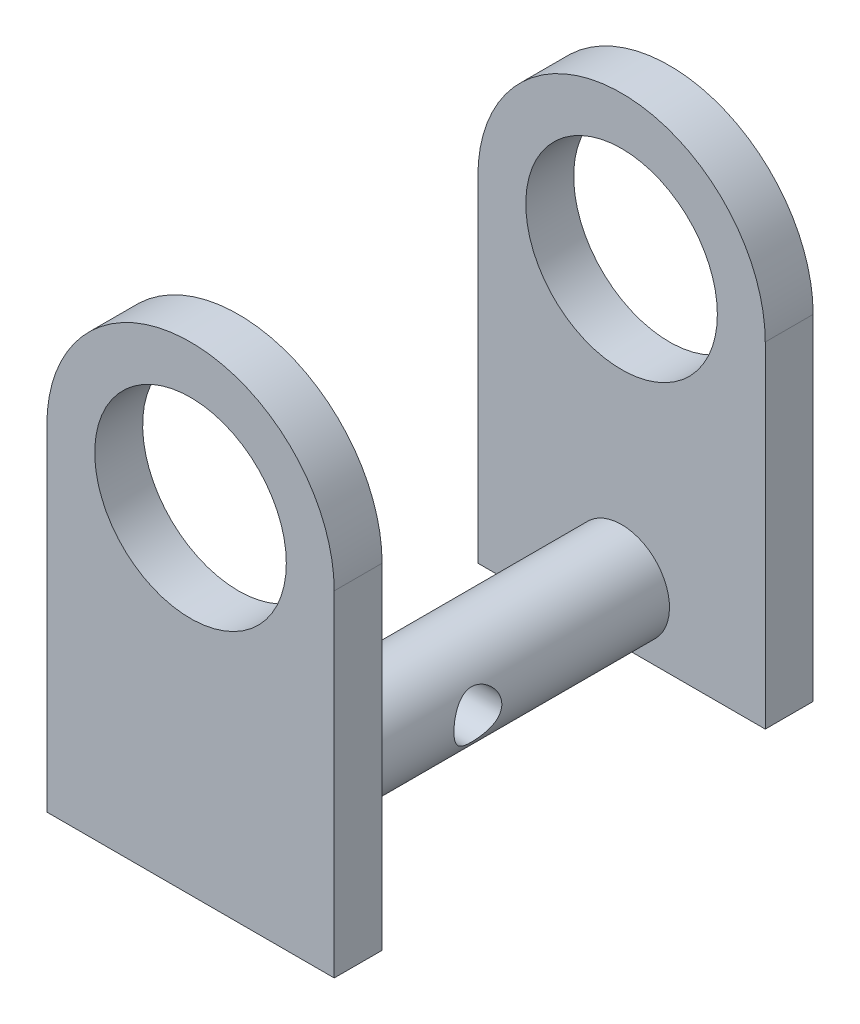
ISO-10303-21;
HEADER;
FILE_DESCRIPTION(('STEP AP214'),'2;1');
FILE_NAME('part.step','',(''),(''),'','','');
FILE_SCHEMA(('AUTOMOTIVE_DESIGN { 1 0 10303 214 1 1 1 1 }'));
ENDSEC;
DATA;
#1=APPLICATION_CONTEXT('core data for automotive mechanical design processes');
#2=APPLICATION_PROTOCOL_DEFINITION('international standard','automotive_design',2000,#1);
#3=PRODUCT_CONTEXT('',#1,'mechanical');
#4=PRODUCT('Part','Part','',(#3));
#5=PRODUCT_RELATED_PRODUCT_CATEGORY('part','',(#4));
#6=PRODUCT_DEFINITION_FORMATION('','',#4);
#7=PRODUCT_DEFINITION_CONTEXT('part definition',#1,'design');
#8=PRODUCT_DEFINITION('design','',#6,#7);
#9=PRODUCT_DEFINITION_SHAPE('','',#8);
#10=(LENGTH_UNIT() NAMED_UNIT(*) SI_UNIT(.MILLI.,.METRE.));
#11=(NAMED_UNIT(*) PLANE_ANGLE_UNIT() SI_UNIT($,.RADIAN.));
#12=(NAMED_UNIT(*) SI_UNIT($,.STERADIAN.) SOLID_ANGLE_UNIT());
#13=UNCERTAINTY_MEASURE_WITH_UNIT(LENGTH_MEASURE(1.E-05),#10,'distance_accuracy_value','');
#14=(GEOMETRIC_REPRESENTATION_CONTEXT(3) GLOBAL_UNCERTAINTY_ASSIGNED_CONTEXT((#13)) GLOBAL_UNIT_ASSIGNED_CONTEXT((#10,
#11,#12)) REPRESENTATION_CONTEXT('',''));
#15=CARTESIAN_POINT('',(0.,0.,0.));
#16=DIRECTION('',(0.,0.,1.));
#17=DIRECTION('',(1.,0.,0.));
#18=AXIS2_PLACEMENT_3D('',#15,#16,#17);
#19=CARTESIAN_POINT('',(0.,-29.,-1.99999999999995));
#20=DIRECTION('',(0.,0.,-1.));
#21=DIRECTION('',(-1.,0.,0.));
#22=AXIS2_PLACEMENT_3D('',#19,#20,#21);
#23=CYLINDRICAL_SURFACE('',#22,5.);
#24=CARTESIAN_POINT('',(-5.,-29.,-22.5));
#25=CARTESIAN_POINT('',(-4.99999177550472,-28.8685733176657,-22.500009669056));
#26=CARTESIAN_POINT('',(-4.99476199135278,-28.7369843655628,-22.510425561774));
#27=CARTESIAN_POINT('',(-4.9743541856102,-28.4776985453771,-22.551631821162));
#28=CARTESIAN_POINT('',(-4.95915727187671,-28.3500095514359,-22.582460880925));
#29=CARTESIAN_POINT('',(-4.92040690922477,-28.1026663686838,-22.6629846227188));
#30=CARTESIAN_POINT('',(-4.8968859590726,-27.9829830546372,-22.7126059877827));
#31=CARTESIAN_POINT('',(-4.84364443325828,-27.7538183960033,-22.8289265262518));
#32=CARTESIAN_POINT('',(-4.81392434644421,-27.6443362479623,-22.8956243531451));
#33=CARTESIAN_POINT('',(-4.74890645050632,-27.43123047369,-23.0487931316426));
#34=CARTESIAN_POINT('',(-4.71337997659091,-27.3283619770569,-23.1362162002298));
#35=CARTESIAN_POINT('',(-4.64149925776731,-27.1380513829667,-23.3263036959853));
#36=CARTESIAN_POINT('',(-4.60514440566898,-27.0506210408845,-23.4289796288401));
#37=CARTESIAN_POINT('',(-4.53247377945622,-26.8868700003275,-23.6562083744453));
#38=CARTESIAN_POINT('',(-4.49637967412567,-26.8119366615094,-23.781840246035));
#39=CARTESIAN_POINT('',(-4.43214946943555,-26.6845794323851,-24.0459183397954));
#40=CARTESIAN_POINT('',(-4.40400769020792,-26.6321394624832,-24.1843553217626));
#41=CARTESIAN_POINT('',(-4.36144667591402,-26.5546688946235,-24.4616627635964));
#42=CARTESIAN_POINT('',(-4.34630678958452,-26.5281853573242,-24.6000111301796));
#43=CARTESIAN_POINT('',(-4.32954724872151,-26.4989325167026,-24.8799470944376));
#44=CARTESIAN_POINT('',(-4.3279142335843,-26.4961397790609,-25.0215313521751));
#45=CARTESIAN_POINT('',(-4.33777325642937,-26.5132817820749,-25.2857150607909));
#46=CARTESIAN_POINT('',(-4.34771909154985,-26.5305386011595,-25.4085600780583));
#47=CARTESIAN_POINT('',(-4.37690571834676,-26.5826503773562,-25.6493047734319));
#48=CARTESIAN_POINT('',(-4.39614947079454,-26.6175109402555,-25.7672028632631));
#49=CARTESIAN_POINT('',(-4.44218691031839,-26.7044755490354,-25.9980728314143));
#50=CARTESIAN_POINT('',(-4.46914601659993,-26.7569623322101,-26.1108659969645));
#51=CARTESIAN_POINT('',(-4.52758510703513,-26.8773957808299,-26.326585731475));
#52=CARTESIAN_POINT('',(-4.55906711950478,-26.9453493904688,-26.4295078390002));
#53=CARTESIAN_POINT('',(-4.62782894758213,-27.1048348627181,-26.6363031318581));
#54=CARTESIAN_POINT('',(-4.66533775591865,-27.1982638540768,-26.7386421839404));
#55=CARTESIAN_POINT('',(-4.73869058251019,-27.4011110531466,-26.9268385464772));
#56=CARTESIAN_POINT('',(-4.77453379897003,-27.5105368585643,-27.0126879800847));
#57=CARTESIAN_POINT('',(-4.84254968207409,-27.7487087354204,-27.1692141525743));
#58=CARTESIAN_POINT('',(-4.87447460405015,-27.8781160210015,-27.2390011811143));
#59=CARTESIAN_POINT('',(-4.92894702803109,-28.148834461278,-27.3552425726075));
#60=CARTESIAN_POINT('',(-4.95150197358894,-28.2901360593368,-27.4017154625379));
#61=CARTESIAN_POINT('',(-4.98310834353579,-28.5680837708482,-27.4661885092917));
#62=CARTESIAN_POINT('',(-4.9931234575324,-28.7041461736291,-27.486228089367));
#63=CARTESIAN_POINT('',(-5.00182533647794,-28.9780510001267,-27.5036618278362));
#64=CARTESIAN_POINT('',(-5.00051746803426,-29.1158925496751,-27.5010667140985));
#65=CARTESIAN_POINT('',(-4.98727980633469,-29.3780824299647,-27.4744832789533));
#66=CARTESIAN_POINT('',(-4.97618114219993,-29.5026485201237,-27.4521686681756));
#67=CARTESIAN_POINT('',(-4.9455542828753,-29.746017230756,-27.3894048202616));
#68=CARTESIAN_POINT('',(-4.92602515837625,-29.8648192142319,-27.3489535838641));
#69=CARTESIAN_POINT('',(-4.87960628532329,-30.0972215211196,-27.2500038339196));
#70=CARTESIAN_POINT('',(-4.85252204417874,-30.2105759924983,-27.1910223747177));
#71=CARTESIAN_POINT('',(-4.79359935799751,-30.4261534042644,-27.0572311608752));
#72=CARTESIAN_POINT('',(-4.76175888940535,-30.528371574502,-26.9824146634801));
#73=CARTESIAN_POINT('',(-4.69270553315087,-30.7294192231549,-26.8105989367091));
#74=CARTESIAN_POINT('',(-4.65527212009489,-30.826930194285,-26.7121428290248));
#75=CARTESIAN_POINT('',(-4.58155978921588,-31.0046408025722,-26.5001871219506));
#76=CARTESIAN_POINT('',(-4.54528168472408,-31.0848284642868,-26.3866772029301));
#77=CARTESIAN_POINT('',(-4.4762798054528,-31.2292697861899,-26.1408908645153));
#78=CARTESIAN_POINT('',(-4.44381323981255,-31.2925637392224,-26.0079718347089));
#79=CARTESIAN_POINT('',(-4.38935180726746,-31.3952070651146,-25.7312248311174));
#80=CARTESIAN_POINT('',(-4.36734345549015,-31.4345872907706,-25.587411184));
#81=CARTESIAN_POINT('',(-4.33903752569352,-31.48465421767,-25.3077244426371));
#82=CARTESIAN_POINT('',(-4.33143458674097,-31.4977324874436,-25.172414365881));
#83=CARTESIAN_POINT('',(-4.3291338659258,-31.501722889509,-24.9013823326193));
#84=CARTESIAN_POINT('',(-4.33443049025111,-31.4926446298327,-24.7656605801264));
#85=CARTESIAN_POINT('',(-4.35594655164664,-31.4548153019733,-24.5112912443832));
#86=CARTESIAN_POINT('',(-4.37107736338133,-31.428020743027,-24.3922488182792));
#87=CARTESIAN_POINT('',(-4.40927540337603,-31.3579384384054,-24.1604797078));
#88=CARTESIAN_POINT('',(-4.43234518434966,-31.3146453872873,-24.0477550684335));
#89=CARTESIAN_POINT('',(-4.48571326433413,-31.2095391931554,-23.8234378472803));
#90=CARTESIAN_POINT('',(-4.5163930799845,-31.146677190094,-23.712430148265));
#91=CARTESIAN_POINT('',(-4.58088327077456,-31.0053780838799,-23.50181375676));
#92=CARTESIAN_POINT('',(-4.61469526970767,-30.9269328776589,-23.4022110373713));
#93=CARTESIAN_POINT('',(-4.68655816327011,-30.7455055694607,-23.2046446362504));
#94=CARTESIAN_POINT('',(-4.72462491514981,-30.6407002246921,-23.1083506358286));
#95=CARTESIAN_POINT('',(-4.79694347383546,-30.4153978542068,-22.9343441505719));
#96=CARTESIAN_POINT('',(-4.83119321905447,-30.2948924242633,-22.8566416813941));
#97=CARTESIAN_POINT('',(-4.89245149457782,-30.0397880887854,-22.7219030205159));
#98=CARTESIAN_POINT('',(-4.91940711437489,-29.9050955607823,-22.6650168322155));
#99=CARTESIAN_POINT('',(-4.95177960923351,-29.6963287092574,-22.5978161412076));
#100=CARTESIAN_POINT('',(-4.96122314081874,-29.6256704134941,-22.5784446019982));
#101=CARTESIAN_POINT('',(-4.97717127275101,-29.4826239978393,-22.5459340516294));
#102=CARTESIAN_POINT('',(-4.98367766823159,-29.4102369630924,-22.5327912333236));
#103=CARTESIAN_POINT('',(-4.9923820076613,-29.2815186846217,-22.5152625277154));
#104=CARTESIAN_POINT('',(-4.99523288466454,-29.2254084995554,-22.5095450634687));
#105=CARTESIAN_POINT('',(-4.99904367329659,-29.1128755284563,-22.5019116705343));
#106=CARTESIAN_POINT('',(-5.00000353273198,-29.0564527338382,-22.4999958467745));
#107=CARTESIAN_POINT('',(-5.,-29.,-22.5));
#108=B_SPLINE_CURVE_WITH_KNOTS('',3,(#24,#25,#26,#27,#28,#29,#30,#31,#32,#33,#34,#35,#36,#37,
#38,#39,#40,#41,#42,#43,#44,#45,#46,#47,#48,#49,#50,#51,#52,#53,#54,#55,#56,#57,#58,#59,#60,#61,
#62,#63,#64,#65,#66,#67,#68,#69,#70,#71,#72,#73,#74,#75,#76,#77,#78,#79,#80,#81,#82,#83,#84,#85,
#86,#87,#88,#89,#90,#91,#92,#93,#94,#95,#96,#97,#98,#99,#100,#101,#102,#103,#104,#105,#106,
#107),.UNSPECIFIED.,.T.,.F.,(4,2,2,2,2,2,2,2,2,2,2,2,2,2,2,2,2,2,2,2,2,2,2,2,2,2,2,2,2,2,2,2,2,
2,2,2,2,2,2,2,2,4),(0.,0.39406064355073,0.788870374272992,1.18215538873074,1.57540940145391,
1.99245439679522,2.40981559413508,2.85954316076881,3.30894869745702,3.73145030350574,
4.15353393322551,4.52514281023301,4.89687009814196,5.27725600421218,5.65781303150554,
6.08662353334696,6.51563836496716,6.96457555536101,7.41315542280698,7.82458226178363,
8.2358141127869,8.61517266265304,8.99457304077329,9.38482140069746,9.77523626870848,
10.2039902661037,10.6330397153795,11.0828670540368,11.53211279863,11.9382326875698,
12.3441764966106,12.7114482562151,13.0788382197025,13.4709114195009,13.8631890285845,
14.303131068923,14.7433095845248,15.1866003415818,15.407934939208,15.6291340766843,
15.7983933645035,15.9676573239322),.UNSPECIFIED.);
#109=CARTESIAN_POINT('',(-5.,-29.,-22.5));
#110=VERTEX_POINT('',#109);
#111=EDGE_CURVE('E53',#110,#110,#108,.T.);
#112=ORIENTED_EDGE('',*,*,#111,.F.);
#113=EDGE_LOOP('',(#112));
#114=FACE_BOUND('',#113,.T.);
#115=CARTESIAN_POINT('',(5.00000000000001,-29.,-27.5));
#116=CARTESIAN_POINT('',(4.99999177550472,-28.8685733176657,-27.499990330944));
#117=CARTESIAN_POINT('',(4.99476199135278,-28.7369843655628,-27.489574438226));
#118=CARTESIAN_POINT('',(4.9743541856102,-28.4776985453771,-27.4483681788379));
#119=CARTESIAN_POINT('',(4.95915727187671,-28.3500095514359,-27.417539119075));
#120=CARTESIAN_POINT('',(4.92040690922477,-28.1026663686838,-27.3370153772811));
#121=CARTESIAN_POINT('',(4.89688595907259,-27.9829830546372,-27.2873940122173));
#122=CARTESIAN_POINT('',(4.84364443325827,-27.7538183960033,-27.1710734737482));
#123=CARTESIAN_POINT('',(4.81392434644421,-27.6443362479623,-27.1043756468549));
#124=CARTESIAN_POINT('',(4.74890645050632,-27.43123047369,-26.9512068683574));
#125=CARTESIAN_POINT('',(4.71337997659091,-27.3283619770569,-26.8637837997702));
#126=CARTESIAN_POINT('',(4.64149925776731,-27.1380513829667,-26.6736963040147));
#127=CARTESIAN_POINT('',(4.60514440566897,-27.0506210408844,-26.5710203711599));
#128=CARTESIAN_POINT('',(4.53247377945622,-26.8868700003275,-26.3437916255547));
#129=CARTESIAN_POINT('',(4.49637967412567,-26.8119366615094,-26.218159753965));
#130=CARTESIAN_POINT('',(4.43214946943555,-26.6845794323851,-25.9540816602045));
#131=CARTESIAN_POINT('',(4.40400769020792,-26.6321394624832,-25.8156446782374));
#132=CARTESIAN_POINT('',(4.36144667591402,-26.5546688946235,-25.5383372364036));
#133=CARTESIAN_POINT('',(4.34630678958452,-26.5281853573242,-25.3999888698204));
#134=CARTESIAN_POINT('',(4.32954724872151,-26.4989325167026,-25.1200529055624));
#135=CARTESIAN_POINT('',(4.3279142335843,-26.4961397790609,-24.9784686478249));
#136=CARTESIAN_POINT('',(4.33777325642937,-26.5132817820749,-24.7142849392091));
#137=CARTESIAN_POINT('',(4.34771909154985,-26.5305386011595,-24.5914399219417));
#138=CARTESIAN_POINT('',(4.37690571834676,-26.5826503773562,-24.350695226568));
#139=CARTESIAN_POINT('',(4.39614947079454,-26.6175109402555,-24.2327971367369));
#140=CARTESIAN_POINT('',(4.44218691031839,-26.7044755490354,-24.0019271685857));
#141=CARTESIAN_POINT('',(4.46914601659993,-26.7569623322101,-23.8891340030355));
#142=CARTESIAN_POINT('',(4.52758510703513,-26.8773957808299,-23.673414268525));
#143=CARTESIAN_POINT('',(4.55906711950478,-26.9453493904688,-23.5704921609998));
#144=CARTESIAN_POINT('',(4.62782894758214,-27.1048348627181,-23.3636968681419));
#145=CARTESIAN_POINT('',(4.66533775591865,-27.1982638540768,-23.2613578160596));
#146=CARTESIAN_POINT('',(4.73869058251019,-27.4011110531466,-23.0731614535227));
#147=CARTESIAN_POINT('',(4.77453379897003,-27.5105368585643,-22.9873120199153));
#148=CARTESIAN_POINT('',(4.84254968207409,-27.7487087354204,-22.8307858474257));
#149=CARTESIAN_POINT('',(4.87447460405016,-27.8781160210015,-22.7609988188856));
#150=CARTESIAN_POINT('',(4.92894702803109,-28.148834461278,-22.6447574273925));
#151=CARTESIAN_POINT('',(4.95150197358894,-28.2901360593368,-22.5982845374621));
#152=CARTESIAN_POINT('',(4.9831083435358,-28.5680837708482,-22.5338114907083));
#153=CARTESIAN_POINT('',(4.9931234575324,-28.7041461736291,-22.513771910633));
#154=CARTESIAN_POINT('',(5.00182533647794,-28.9780510001267,-22.4963381721638));
#155=CARTESIAN_POINT('',(5.00051746803426,-29.1158925496751,-22.4989332859015));
#156=CARTESIAN_POINT('',(4.98727980633469,-29.3780824299647,-22.5255167210467));
#157=CARTESIAN_POINT('',(4.97618114219993,-29.5026485201237,-22.5478313318244));
#158=CARTESIAN_POINT('',(4.9455542828753,-29.746017230756,-22.6105951797384));
#159=CARTESIAN_POINT('',(4.92602515837625,-29.8648192142319,-22.6510464161359));
#160=CARTESIAN_POINT('',(4.87960628532329,-30.0972215211196,-22.7499961660804));
#161=CARTESIAN_POINT('',(4.85252204417874,-30.2105759924983,-22.8089776252823));
#162=CARTESIAN_POINT('',(4.79359935799751,-30.4261534042644,-22.9427688391248));
#163=CARTESIAN_POINT('',(4.76175888940535,-30.528371574502,-23.0175853365199));
#164=CARTESIAN_POINT('',(4.69270553315087,-30.7294192231549,-23.1894010632909));
#165=CARTESIAN_POINT('',(4.65527212009488,-30.826930194285,-23.2878571709752));
#166=CARTESIAN_POINT('',(4.58155978921587,-31.0046408025722,-23.4998128780494));
#167=CARTESIAN_POINT('',(4.54528168472408,-31.0848284642869,-23.6133227970699));
#168=CARTESIAN_POINT('',(4.4762798054528,-31.2292697861899,-23.8591091354846));
#169=CARTESIAN_POINT('',(4.44381323981255,-31.2925637392224,-23.9920281652911));
#170=CARTESIAN_POINT('',(4.38935180726746,-31.3952070651146,-24.2687751688825));
#171=CARTESIAN_POINT('',(4.36734345549014,-31.4345872907706,-24.412588816));
#172=CARTESIAN_POINT('',(4.33903752569352,-31.4846542176701,-24.6922755573629));
#173=CARTESIAN_POINT('',(4.33143458674097,-31.4977324874436,-24.827585634119));
#174=CARTESIAN_POINT('',(4.3291338659258,-31.501722889509,-25.0986176673807));
#175=CARTESIAN_POINT('',(4.33443049025111,-31.4926446298327,-25.2343394198736));
#176=CARTESIAN_POINT('',(4.35594655164664,-31.4548153019733,-25.4887087556168));
#177=CARTESIAN_POINT('',(4.37107736338134,-31.428020743027,-25.6077511817208));
#178=CARTESIAN_POINT('',(4.40927540337603,-31.3579384384054,-25.8395202921999));
#179=CARTESIAN_POINT('',(4.43234518434966,-31.3146453872873,-25.9522449315665));
#180=CARTESIAN_POINT('',(4.48571326433413,-31.2095391931554,-26.1765621527197));
#181=CARTESIAN_POINT('',(4.5163930799845,-31.146677190094,-26.287569851735));
#182=CARTESIAN_POINT('',(4.58088327077456,-31.0053780838799,-26.49818624324));
#183=CARTESIAN_POINT('',(4.61469526970767,-30.9269328776589,-26.5977889626287));
#184=CARTESIAN_POINT('',(4.68655816327011,-30.7455055694607,-26.7953553637496));
#185=CARTESIAN_POINT('',(4.72462491514981,-30.6407002246921,-26.8916493641714));
#186=CARTESIAN_POINT('',(4.79694347383546,-30.4153978542068,-27.065655849428));
#187=CARTESIAN_POINT('',(4.83119321905447,-30.2948924242633,-27.1433583186059));
#188=CARTESIAN_POINT('',(4.89245149457782,-30.0397880887854,-27.2780969794841));
#189=CARTESIAN_POINT('',(4.91940711437489,-29.9050955607823,-27.3349831677844));
#190=CARTESIAN_POINT('',(4.95177960923351,-29.6963287092574,-27.4021838587924));
#191=CARTESIAN_POINT('',(4.96122314081874,-29.6256704134941,-27.4215553980018));
#192=CARTESIAN_POINT('',(4.97717127275101,-29.4826239978393,-27.4540659483706));
#193=CARTESIAN_POINT('',(4.98367766823159,-29.4102369630924,-27.4672087666763));
#194=CARTESIAN_POINT('',(4.9923820076613,-29.2815186846217,-27.4847374722846));
#195=CARTESIAN_POINT('',(4.99523288466455,-29.2254084995554,-27.4904549365313));
#196=CARTESIAN_POINT('',(4.99904367329659,-29.1128755284563,-27.4980883294657));
#197=CARTESIAN_POINT('',(5.00000353273198,-29.0564527338382,-27.5000041532255));
#198=CARTESIAN_POINT('',(5.00000000000001,-29.,-27.5));
#199=B_SPLINE_CURVE_WITH_KNOTS('',3,(#115,#116,#117,#118,#119,#120,#121,#122,#123,#124,#125,
#126,#127,#128,#129,#130,#131,#132,#133,#134,#135,#136,#137,#138,#139,#140,#141,#142,#143,#144,
#145,#146,#147,#148,#149,#150,#151,#152,#153,#154,#155,#156,#157,#158,#159,#160,#161,#162,#163,
#164,#165,#166,#167,#168,#169,#170,#171,#172,#173,#174,#175,#176,#177,#178,#179,#180,#181,#182,
#183,#184,#185,#186,#187,#188,#189,#190,#191,#192,#193,#194,#195,#196,#197,#198),.UNSPECIFIED.,
.T.,.F.,(4,2,2,2,2,2,2,2,2,2,2,2,2,2,2,2,2,2,2,2,2,2,2,2,2,2,2,2,2,2,2,2,2,2,2,2,2,2,2,2,2,4),
(0.,0.394060643550734,0.788870374272997,1.18215538873076,1.57540940145392,1.99245439679523,
2.40981559413509,2.85954316076882,3.30894869745703,3.73145030350575,4.15353393322551,
4.52514281023302,4.89687009814196,5.27725600421218,5.65781303150554,6.08662353334696,
6.51563836496716,6.96457555536102,7.41315542280699,7.82458226178364,8.2358141127869,
8.61517266265304,8.99457304077328,9.38482140069746,9.77523626870848,10.2039902661037,
10.6330397153795,11.0828670540368,11.53211279863,11.9382326875698,12.3441764966106,
12.7114482562151,13.0788382197025,13.4709114195009,13.8631890285845,14.303131068923,
14.7433095845248,15.1866003415818,15.407934939208,15.6291340766843,15.7983933645035,
15.9676573239322),.UNSPECIFIED.);
#200=CARTESIAN_POINT('',(5.00000000000001,-29.,-27.5));
#201=VERTEX_POINT('',#200);
#202=EDGE_CURVE('E215',#201,#201,#199,.T.);
#203=ORIENTED_EDGE('',*,*,#202,.F.);
#204=EDGE_LOOP('',(#203));
#205=FACE_BOUND('',#204,.T.);
#206=CARTESIAN_POINT('',(0.,-29.,-45.));
#207=DIRECTION('',(0.,0.,-1.));
#208=DIRECTION('',(0.,1.,0.));
#209=AXIS2_PLACEMENT_3D('',#206,#207,#208);
#210=CIRCLE('',#209,5.);
#211=CARTESIAN_POINT('',(0.,-24.,-45.));
#212=VERTEX_POINT('',#211);
#213=EDGE_CURVE('E168',#212,#212,#210,.T.);
#214=ORIENTED_EDGE('',*,*,#213,.F.);
#215=EDGE_LOOP('',(#214));
#216=FACE_BOUND('',#215,.T.);
#217=CARTESIAN_POINT('',(0.,-29.,-5.00000000000001));
#218=DIRECTION('',(0.,0.,1.));
#219=DIRECTION('',(0.,-1.,0.));
#220=AXIS2_PLACEMENT_3D('',#217,#218,#219);
#221=CIRCLE('',#220,5.);
#222=CARTESIAN_POINT('',(0.,-34.,-5.00000000000001));
#223=VERTEX_POINT('',#222);
#224=EDGE_CURVE('E212',#223,#223,#221,.F.);
#225=ORIENTED_EDGE('',*,*,#224,.T.);
#226=EDGE_LOOP('',(#225));
#227=FACE_BOUND('',#226,.T.);
#228=ADVANCED_FACE('F49',(#114,#205,#216,#227),#23,.T.);
#229=CARTESIAN_POINT('',(0.,0.,-50.));
#230=DIRECTION('',(0.,0.,1.));
#231=DIRECTION('',(1.,0.,0.));
#232=AXIS2_PLACEMENT_3D('',#229,#230,#231);
#233=CYLINDRICAL_SURFACE('',#232,10.);
#234=CARTESIAN_POINT('',(0.,0.,-45.));
#235=DIRECTION('',(0.,0.,-1.));
#236=DIRECTION('',(0.,1.,0.));
#237=AXIS2_PLACEMENT_3D('',#234,#235,#236);
#238=CIRCLE('',#237,10.);
#239=CARTESIAN_POINT('',(0.,10.,-45.));
#240=VERTEX_POINT('',#239);
#241=EDGE_CURVE('E174',#240,#240,#238,.F.);
#242=ORIENTED_EDGE('',*,*,#241,.T.);
#243=EDGE_LOOP('',(#242));
#244=FACE_BOUND('',#243,.T.);
#245=CARTESIAN_POINT('',(0.,0.,-50.));
#246=DIRECTION('',(0.,0.,1.));
#247=DIRECTION('',(1.,0.,0.));
#248=AXIS2_PLACEMENT_3D('',#245,#246,#247);
#249=CIRCLE('',#248,10.);
#250=CARTESIAN_POINT('',(10.,0.,-50.));
#251=VERTEX_POINT('',#250);
#252=EDGE_CURVE('E178',#251,#251,#249,.T.);
#253=ORIENTED_EDGE('',*,*,#252,.F.);
#254=EDGE_LOOP('',(#253));
#255=FACE_BOUND('',#254,.T.);
#256=ADVANCED_FACE('F51',(#244,#255),#233,.F.);
#257=CARTESIAN_POINT('',(0.,0.,-50.));
#258=DIRECTION('',(0.,0.,1.));
#259=DIRECTION('',(1.,0.,0.));
#260=AXIS2_PLACEMENT_3D('',#257,#258,#259);
#261=PLANE('',#260);
#262=ORIENTED_EDGE('',*,*,#252,.T.);
#263=EDGE_LOOP('',(#262));
#264=FACE_BOUND('',#263,.T.);
#265=DIRECTION('',(0.,-1.,0.));
#266=VECTOR('',#265,1.);
#267=CARTESIAN_POINT('',(15.,0.,-50.));
#268=LINE('',#267,#266);
#269=CARTESIAN_POINT('',(15.,0.,-50.));
#270=VERTEX_POINT('',#269);
#271=CARTESIAN_POINT('',(15.,-35.,-50.));
#272=VERTEX_POINT('',#271);
#273=EDGE_CURVE('E182',#270,#272,#268,.T.);
#274=ORIENTED_EDGE('',*,*,#273,.T.);
#275=DIRECTION('',(-1.,0.,0.));
#276=VECTOR('',#275,1.);
#277=CARTESIAN_POINT('',(0.,-35.,-50.));
#278=LINE('',#277,#276);
#279=CARTESIAN_POINT('',(-15.,-35.,-50.));
#280=VERTEX_POINT('',#279);
#281=EDGE_CURVE('E79',#272,#280,#278,.T.);
#282=ORIENTED_EDGE('',*,*,#281,.T.);
#283=DIRECTION('',(0.,-1.,0.));
#284=VECTOR('',#283,1.);
#285=CARTESIAN_POINT('',(-15.,0.,-50.));
#286=LINE('',#285,#284);
#287=CARTESIAN_POINT('',(-15.,0.,-50.));
#288=VERTEX_POINT('',#287);
#289=EDGE_CURVE('E189',#288,#280,#286,.T.);
#290=ORIENTED_EDGE('',*,*,#289,.F.);
#291=CARTESIAN_POINT('',(0.,0.,-50.));
#292=DIRECTION('',(0.,0.,1.));
#293=DIRECTION('',(1.,0.,0.));
#294=AXIS2_PLACEMENT_3D('',#291,#292,#293);
#295=CIRCLE('',#294,15.);
#296=EDGE_CURVE('E185',#270,#288,#295,.T.);
#297=ORIENTED_EDGE('',*,*,#296,.F.);
#298=EDGE_LOOP('',(#274,#282,#290,#297));
#299=FACE_BOUND('',#298,.T.);
#300=ADVANCED_FACE('F263',(#264,#299),#261,.F.);
#301=CARTESIAN_POINT('',(0.,0.,-50.));
#302=DIRECTION('',(0.,0.,1.));
#303=DIRECTION('',(1.,0.,0.));
#304=AXIS2_PLACEMENT_3D('',#301,#302,#303);
#305=CYLINDRICAL_SURFACE('',#304,15.);
#306=DIRECTION('',(0.,0.,1.));
#307=VECTOR('',#306,1.);
#308=CARTESIAN_POINT('',(-15.,0.,-50.));
#309=LINE('',#308,#307);
#310=CARTESIAN_POINT('',(-15.,0.,-45.));
#311=VERTEX_POINT('',#310);
#312=EDGE_CURVE('E202',#288,#311,#309,.T.);
#313=ORIENTED_EDGE('',*,*,#312,.T.);
#314=CARTESIAN_POINT('',(0.,0.,-45.));
#315=DIRECTION('',(0.,0.,-1.));
#316=DIRECTION('',(0.,1.,0.));
#317=AXIS2_PLACEMENT_3D('',#314,#315,#316);
#318=CIRCLE('',#317,15.);
#319=CARTESIAN_POINT('',(15.,0.,-45.));
#320=VERTEX_POINT('',#319);
#321=EDGE_CURVE('E11',#320,#311,#318,.F.);
#322=ORIENTED_EDGE('',*,*,#321,.F.);
#323=DIRECTION('',(0.,0.,1.));
#324=VECTOR('',#323,1.);
#325=CARTESIAN_POINT('',(15.,0.,-50.));
#326=LINE('',#325,#324);
#327=EDGE_CURVE('E195',#270,#320,#326,.T.);
#328=ORIENTED_EDGE('',*,*,#327,.F.);
#329=ORIENTED_EDGE('',*,*,#296,.T.);
#330=EDGE_LOOP('',(#313,#322,#328,#329));
#331=FACE_BOUND('',#330,.T.);
#332=ADVANCED_FACE('F282',(#331),#305,.T.);
#333=CARTESIAN_POINT('',(-15.,0.,-50.));
#334=DIRECTION('',(-1.,0.,0.));
#335=DIRECTION('',(0.,-1.,0.));
#336=AXIS2_PLACEMENT_3D('',#333,#334,#335);
#337=PLANE('',#336);
#338=DIRECTION('',(0.,-1.,0.));
#339=VECTOR('',#338,1.);
#340=CARTESIAN_POINT('',(-15.,0.,-45.));
#341=LINE('',#340,#339);
#342=CARTESIAN_POINT('',(-15.,-35.,-45.));
#343=VERTEX_POINT('',#342);
#344=EDGE_CURVE('E171',#311,#343,#341,.T.);
#345=ORIENTED_EDGE('',*,*,#344,.F.);
#346=ORIENTED_EDGE('',*,*,#312,.F.);
#347=ORIENTED_EDGE('',*,*,#289,.T.);
#348=DIRECTION('',(0.,0.,1.));
#349=VECTOR('',#348,1.);
#350=CARTESIAN_POINT('',(-15.,-35.,-50.));
#351=LINE('',#350,#349);
#352=EDGE_CURVE('E198',#280,#343,#351,.T.);
#353=ORIENTED_EDGE('',*,*,#352,.T.);
#354=EDGE_LOOP('',(#345,#346,#347,#353));
#355=FACE_BOUND('',#354,.T.);
#356=ADVANCED_FACE('F291',(#355),#337,.T.);
#357=CARTESIAN_POINT('',(0.,-35.,-50.));
#358=DIRECTION('',(0.,1.,0.));
#359=DIRECTION('',(0.,0.,1.));
#360=AXIS2_PLACEMENT_3D('',#357,#358,#359);
#361=PLANE('',#360);
#362=DIRECTION('',(0.,0.,1.));
#363=VECTOR('',#362,1.);
#364=CARTESIAN_POINT('',(15.,-35.,-50.));
#365=LINE('',#364,#363);
#366=CARTESIAN_POINT('',(15.,-35.,-45.));
#367=VERTEX_POINT('',#366);
#368=EDGE_CURVE('E64',#272,#367,#365,.T.);
#369=ORIENTED_EDGE('',*,*,#368,.T.);
#370=DIRECTION('',(1.,0.,0.));
#371=VECTOR('',#370,1.);
#372=CARTESIAN_POINT('',(-40.,-35.,-45.));
#373=LINE('',#372,#371);
#374=EDGE_CURVE('E167',#343,#367,#373,.T.);
#375=ORIENTED_EDGE('',*,*,#374,.F.);
#376=ORIENTED_EDGE('',*,*,#352,.F.);
#377=ORIENTED_EDGE('',*,*,#281,.F.);
#378=EDGE_LOOP('',(#369,#375,#376,#377));
#379=FACE_BOUND('',#378,.T.);
#380=ADVANCED_FACE('F289',(#379),#361,.F.);
#381=CARTESIAN_POINT('',(15.,0.,-50.));
#382=DIRECTION('',(-1.,0.,0.));
#383=DIRECTION('',(0.,-1.,0.));
#384=AXIS2_PLACEMENT_3D('',#381,#382,#383);
#385=PLANE('',#384);
#386=ORIENTED_EDGE('',*,*,#327,.T.);
#387=DIRECTION('',(0.,1.,0.));
#388=VECTOR('',#387,1.);
#389=CARTESIAN_POINT('',(15.,15.,-45.));
#390=LINE('',#389,#388);
#391=EDGE_CURVE('E71',#367,#320,#390,.T.);
#392=ORIENTED_EDGE('',*,*,#391,.F.);
#393=ORIENTED_EDGE('',*,*,#368,.F.);
#394=ORIENTED_EDGE('',*,*,#273,.F.);
#395=EDGE_LOOP('',(#386,#392,#393,#394));
#396=FACE_BOUND('',#395,.T.);
#397=ADVANCED_FACE('F255',(#396),#385,.F.);
#398=CARTESIAN_POINT('',(-40.,15.,-45.));
#399=DIRECTION('',(0.,0.,-1.));
#400=DIRECTION('',(0.,1.,0.));
#401=AXIS2_PLACEMENT_3D('',#398,#399,#400);
#402=PLANE('',#401);
#403=ORIENTED_EDGE('',*,*,#213,.T.);
#404=EDGE_LOOP('',(#403));
#405=FACE_BOUND('',#404,.T.);
#406=ORIENTED_EDGE('',*,*,#344,.T.);
#407=ORIENTED_EDGE('',*,*,#374,.T.);
#408=ORIENTED_EDGE('',*,*,#391,.T.);
#409=ORIENTED_EDGE('',*,*,#321,.T.);
#410=EDGE_LOOP('',(#406,#407,#408,#409));
#411=FACE_BOUND('',#410,.T.);
#412=ORIENTED_EDGE('',*,*,#241,.F.);
#413=EDGE_LOOP('',(#412));
#414=FACE_BOUND('',#413,.T.);
#415=ADVANCED_FACE('F250',(#405,#411,#414),#402,.F.);
#416=CARTESIAN_POINT('',(15.,0.,-50.));
#417=DIRECTION('',(-1.,0.,0.));
#418=DIRECTION('',(0.,-1.,0.));
#419=AXIS2_PLACEMENT_3D('',#416,#417,#418);
#420=PLANE('',#419);
#421=DIRECTION('',(0.,0.,1.));
#422=VECTOR('',#421,1.);
#423=CARTESIAN_POINT('',(15.,-35.,-50.));
#424=LINE('',#423,#422);
#425=CARTESIAN_POINT('',(15.,-35.,-5.00000000000001));
#426=VERTEX_POINT('',#425);
#427=CARTESIAN_POINT('',(15.,-35.,0.));
#428=VERTEX_POINT('',#427);
#429=EDGE_CURVE('E399',#426,#428,#424,.T.);
#430=ORIENTED_EDGE('',*,*,#429,.F.);
#431=DIRECTION('',(0.,-1.,0.));
#432=VECTOR('',#431,1.);
#433=CARTESIAN_POINT('',(15.,15.,-5.));
#434=LINE('',#433,#432);
#435=CARTESIAN_POINT('',(15.,0.,-5.));
#436=VERTEX_POINT('',#435);
#437=EDGE_CURVE('E143',#436,#426,#434,.T.);
#438=ORIENTED_EDGE('',*,*,#437,.F.);
#439=DIRECTION('',(0.,0.,1.));
#440=VECTOR('',#439,1.);
#441=CARTESIAN_POINT('',(15.,0.,-50.));
#442=LINE('',#441,#440);
#443=CARTESIAN_POINT('',(15.,0.,0.));
#444=VERTEX_POINT('',#443);
#445=EDGE_CURVE('E141',#436,#444,#442,.T.);
#446=ORIENTED_EDGE('',*,*,#445,.T.);
#447=DIRECTION('',(0.,-1.,0.));
#448=VECTOR('',#447,1.);
#449=CARTESIAN_POINT('',(15.,0.,0.));
#450=LINE('',#449,#448);
#451=EDGE_CURVE('E164',#444,#428,#450,.T.);
#452=ORIENTED_EDGE('',*,*,#451,.T.);
#453=EDGE_LOOP('',(#430,#438,#446,#452));
#454=FACE_BOUND('',#453,.T.);
#455=ADVANCED_FACE('F247',(#454),#420,.F.);
#456=CARTESIAN_POINT('',(0.,-35.,-50.));
#457=DIRECTION('',(0.,1.,0.));
#458=DIRECTION('',(0.,0.,1.));
#459=AXIS2_PLACEMENT_3D('',#456,#457,#458);
#460=PLANE('',#459);
#461=DIRECTION('',(0.,0.,1.));
#462=VECTOR('',#461,1.);
#463=CARTESIAN_POINT('',(-15.,-35.,-50.));
#464=LINE('',#463,#462);
#465=CARTESIAN_POINT('',(-15.,-35.,-5.00000000000001));
#466=VERTEX_POINT('',#465);
#467=CARTESIAN_POINT('',(-15.,-35.,0.));
#468=VERTEX_POINT('',#467);
#469=EDGE_CURVE('E160',#466,#468,#464,.T.);
#470=ORIENTED_EDGE('',*,*,#469,.F.);
#471=DIRECTION('',(1.,0.,0.));
#472=VECTOR('',#471,1.);
#473=CARTESIAN_POINT('',(-40.,-35.,-5.00000000000001));
#474=LINE('',#473,#472);
#475=EDGE_CURVE('E128',#466,#426,#474,.T.);
#476=ORIENTED_EDGE('',*,*,#475,.T.);
#477=ORIENTED_EDGE('',*,*,#429,.T.);
#478=DIRECTION('',(-1.,0.,0.));
#479=VECTOR('',#478,1.);
#480=CARTESIAN_POINT('',(0.,-35.,0.));
#481=LINE('',#480,#479);
#482=EDGE_CURVE('E402',#428,#468,#481,.T.);
#483=ORIENTED_EDGE('',*,*,#482,.T.);
#484=EDGE_LOOP('',(#470,#476,#477,#483));
#485=FACE_BOUND('',#484,.T.);
#486=ADVANCED_FACE('F245',(#485),#460,.F.);
#487=CARTESIAN_POINT('',(-15.,0.,-50.));
#488=DIRECTION('',(-1.,0.,0.));
#489=DIRECTION('',(0.,-1.,0.));
#490=AXIS2_PLACEMENT_3D('',#487,#488,#489);
#491=PLANE('',#490);
#492=DIRECTION('',(0.,1.,0.));
#493=VECTOR('',#492,1.);
#494=CARTESIAN_POINT('',(-15.,0.,-5.));
#495=LINE('',#494,#493);
#496=CARTESIAN_POINT('',(-15.,0.,-5.));
#497=VERTEX_POINT('',#496);
#498=EDGE_CURVE('E121',#466,#497,#495,.T.);
#499=ORIENTED_EDGE('',*,*,#498,.F.);
#500=ORIENTED_EDGE('',*,*,#469,.T.);
#501=DIRECTION('',(0.,-1.,0.));
#502=VECTOR('',#501,1.);
#503=CARTESIAN_POINT('',(-15.,0.,0.));
#504=LINE('',#503,#502);
#505=CARTESIAN_POINT('',(-15.,0.,0.));
#506=VERTEX_POINT('',#505);
#507=EDGE_CURVE('E133',#506,#468,#504,.T.);
#508=ORIENTED_EDGE('',*,*,#507,.F.);
#509=DIRECTION('',(0.,0.,1.));
#510=VECTOR('',#509,1.);
#511=CARTESIAN_POINT('',(-15.,0.,-50.));
#512=LINE('',#511,#510);
#513=EDGE_CURVE('E139',#497,#506,#512,.T.);
#514=ORIENTED_EDGE('',*,*,#513,.F.);
#515=EDGE_LOOP('',(#499,#500,#508,#514));
#516=FACE_BOUND('',#515,.T.);
#517=ADVANCED_FACE('F145',(#516),#491,.T.);
#518=CARTESIAN_POINT('',(0.,0.,-50.));
#519=DIRECTION('',(0.,0.,1.));
#520=DIRECTION('',(1.,0.,0.));
#521=AXIS2_PLACEMENT_3D('',#518,#519,#520);
#522=CYLINDRICAL_SURFACE('',#521,10.);
#523=CARTESIAN_POINT('',(0.,0.,-5.));
#524=DIRECTION('',(0.,0.,1.));
#525=DIRECTION('',(0.,-1.,0.));
#526=AXIS2_PLACEMENT_3D('',#523,#524,#525);
#527=CIRCLE('',#526,10.);
#528=CARTESIAN_POINT('',(0.,-10.,-5.));
#529=VERTEX_POINT('',#528);
#530=EDGE_CURVE('E156',#529,#529,#527,.F.);
#531=ORIENTED_EDGE('',*,*,#530,.T.);
#532=EDGE_LOOP('',(#531));
#533=FACE_BOUND('',#532,.T.);
#534=CARTESIAN_POINT('',(0.,0.,0.));
#535=DIRECTION('',(0.,0.,1.));
#536=DIRECTION('',(1.,0.,0.));
#537=AXIS2_PLACEMENT_3D('',#534,#535,#536);
#538=CIRCLE('',#537,10.);
#539=CARTESIAN_POINT('',(10.,0.,0.));
#540=VERTEX_POINT('',#539);
#541=EDGE_CURVE('E150',#540,#540,#538,.T.);
#542=ORIENTED_EDGE('',*,*,#541,.T.);
#543=EDGE_LOOP('',(#542));
#544=FACE_BOUND('',#543,.T.);
#545=ADVANCED_FACE('F237',(#533,#544),#522,.F.);
#546=CARTESIAN_POINT('',(0.,0.,-50.));
#547=DIRECTION('',(0.,0.,1.));
#548=DIRECTION('',(1.,0.,0.));
#549=AXIS2_PLACEMENT_3D('',#546,#547,#548);
#550=CYLINDRICAL_SURFACE('',#549,15.);
#551=ORIENTED_EDGE('',*,*,#445,.F.);
#552=CARTESIAN_POINT('',(0.,0.,-5.));
#553=DIRECTION('',(0.,0.,1.));
#554=DIRECTION('',(0.,-1.,0.));
#555=AXIS2_PLACEMENT_3D('',#552,#553,#554);
#556=CIRCLE('',#555,15.);
#557=EDGE_CURVE('E125',#497,#436,#556,.F.);
#558=ORIENTED_EDGE('',*,*,#557,.F.);
#559=ORIENTED_EDGE('',*,*,#513,.T.);
#560=CARTESIAN_POINT('',(0.,0.,0.));
#561=DIRECTION('',(0.,0.,1.));
#562=DIRECTION('',(1.,0.,0.));
#563=AXIS2_PLACEMENT_3D('',#560,#561,#562);
#564=CIRCLE('',#563,15.);
#565=EDGE_CURVE('E149',#444,#506,#564,.T.);
#566=ORIENTED_EDGE('',*,*,#565,.F.);
#567=EDGE_LOOP('',(#551,#558,#559,#566));
#568=FACE_BOUND('',#567,.T.);
#569=ADVANCED_FACE('F137',(#568),#550,.T.);
#570=CARTESIAN_POINT('',(0.,0.,0.));
#571=DIRECTION('',(0.,0.,1.));
#572=DIRECTION('',(1.,0.,0.));
#573=AXIS2_PLACEMENT_3D('',#570,#571,#572);
#574=PLANE('',#573);
#575=ORIENTED_EDGE('',*,*,#541,.F.);
#576=EDGE_LOOP('',(#575));
#577=FACE_BOUND('',#576,.T.);
#578=ORIENTED_EDGE('',*,*,#451,.F.);
#579=ORIENTED_EDGE('',*,*,#565,.T.);
#580=ORIENTED_EDGE('',*,*,#507,.T.);
#581=ORIENTED_EDGE('',*,*,#482,.F.);
#582=EDGE_LOOP('',(#578,#579,#580,#581));
#583=FACE_BOUND('',#582,.T.);
#584=ADVANCED_FACE('F229',(#577,#583),#574,.T.);
#585=CARTESIAN_POINT('',(-40.,15.,-5.));
#586=DIRECTION('',(0.,0.,1.));
#587=DIRECTION('',(0.,-1.,0.));
#588=AXIS2_PLACEMENT_3D('',#585,#586,#587);
#589=PLANE('',#588);
#590=ORIENTED_EDGE('',*,*,#224,.F.);
#591=EDGE_LOOP('',(#590));
#592=FACE_BOUND('',#591,.T.);
#593=ORIENTED_EDGE('',*,*,#498,.T.);
#594=ORIENTED_EDGE('',*,*,#557,.T.);
#595=ORIENTED_EDGE('',*,*,#437,.T.);
#596=ORIENTED_EDGE('',*,*,#475,.F.);
#597=EDGE_LOOP('',(#593,#594,#595,#596));
#598=FACE_BOUND('',#597,.T.);
#599=ORIENTED_EDGE('',*,*,#530,.F.);
#600=EDGE_LOOP('',(#599));
#601=FACE_BOUND('',#600,.T.);
#602=ADVANCED_FACE('F123',(#592,#598,#601),#589,.F.);
#603=CARTESIAN_POINT('',(-10.,-29.,-25.));
#604=DIRECTION('',(1.,0.,0.));
#605=DIRECTION('',(0.,0.,-1.));
#606=AXIS2_PLACEMENT_3D('',#603,#604,#605);
#607=CYLINDRICAL_SURFACE('',#606,2.5);
#608=ORIENTED_EDGE('',*,*,#111,.T.);
#609=EDGE_LOOP('',(#608));
#610=FACE_BOUND('',#609,.T.);
#611=ORIENTED_EDGE('',*,*,#202,.T.);
#612=EDGE_LOOP('',(#611));
#613=FACE_BOUND('',#612,.T.);
#614=ADVANCED_FACE('F224',(#610,#613),#607,.F.);
#615=CLOSED_SHELL('',(#228,#256,#300,#332,#356,#380,#397,#415,#455,#486,#517,#545,#569,#584,
#602,#614));
#616=MANIFOLD_SOLID_BREP('B2',#615);
#617=ADVANCED_BREP_SHAPE_REPRESENTATION('',(#18,#616),#14);
#618=SHAPE_DEFINITION_REPRESENTATION(#9,#617);
ENDSEC;
END-ISO-10303-21;
